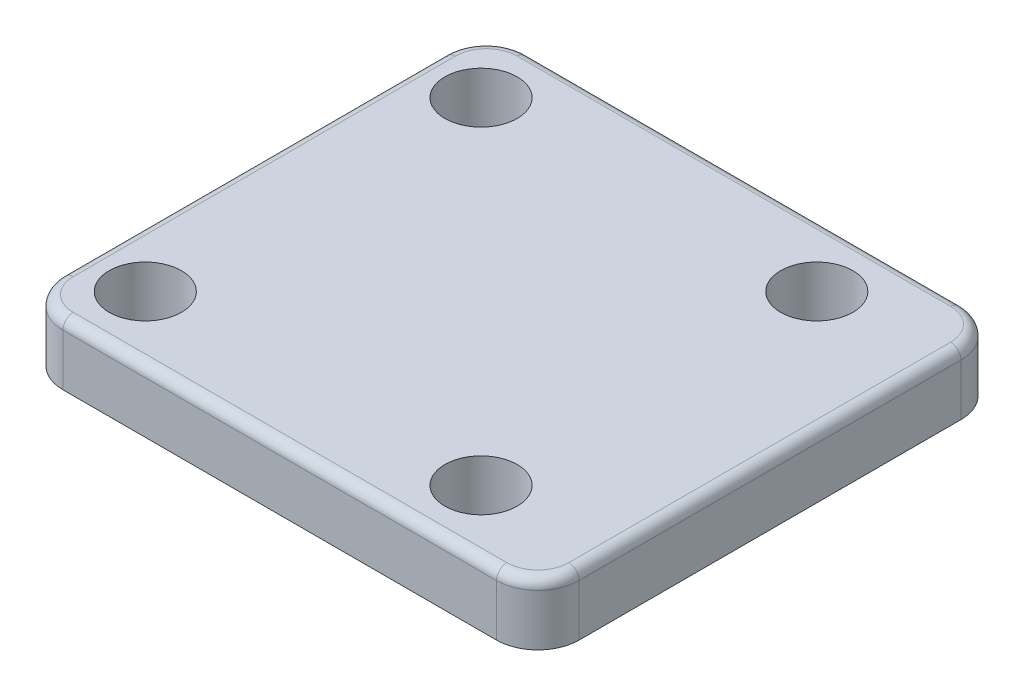
ISO-10303-21;
HEADER;
FILE_DESCRIPTION(('STEP AP214'),'2;1');
FILE_NAME('part.step','',(''),(''),'','','');
FILE_SCHEMA(('AUTOMOTIVE_DESIGN { 1 0 10303 214 1 1 1 1 }'));
ENDSEC;
DATA;
#1=APPLICATION_CONTEXT('core data for automotive mechanical design processes');
#2=APPLICATION_PROTOCOL_DEFINITION('international standard','automotive_design',2000,#1);
#3=PRODUCT_CONTEXT('',#1,'mechanical');
#4=PRODUCT('Part','Part','',(#3));
#5=PRODUCT_RELATED_PRODUCT_CATEGORY('part','',(#4));
#6=PRODUCT_DEFINITION_FORMATION('','',#4);
#7=PRODUCT_DEFINITION_CONTEXT('part definition',#1,'design');
#8=PRODUCT_DEFINITION('design','',#6,#7);
#9=PRODUCT_DEFINITION_SHAPE('','',#8);
#10=(LENGTH_UNIT() NAMED_UNIT(*) SI_UNIT(.MILLI.,.METRE.));
#11=(NAMED_UNIT(*) PLANE_ANGLE_UNIT() SI_UNIT($,.RADIAN.));
#12=(NAMED_UNIT(*) SI_UNIT($,.STERADIAN.) SOLID_ANGLE_UNIT());
#13=UNCERTAINTY_MEASURE_WITH_UNIT(LENGTH_MEASURE(1.E-05),#10,'distance_accuracy_value','');
#14=(GEOMETRIC_REPRESENTATION_CONTEXT(3) GLOBAL_UNCERTAINTY_ASSIGNED_CONTEXT((#13)) GLOBAL_UNIT_ASSIGNED_CONTEXT((#10,
#11,#12)) REPRESENTATION_CONTEXT('',''));
#15=CARTESIAN_POINT('',(0.,0.,0.));
#16=DIRECTION('',(0.,0.,1.));
#17=DIRECTION('',(1.,0.,0.));
#18=AXIS2_PLACEMENT_3D('',#15,#16,#17);
#19=CARTESIAN_POINT('',(24.,6.,-18.5));
#20=DIRECTION('',(0.,-1.,0.));
#21=DIRECTION('',(0.,0.,-1.));
#22=AXIS2_PLACEMENT_3D('',#19,#20,#21);
#23=CYLINDRICAL_SURFACE('',#22,4.);
#24=DIRECTION('',(0.,-1.,0.));
#25=VECTOR('',#24,1.);
#26=CARTESIAN_POINT('',(24.,6.,-22.5));
#27=LINE('',#26,#25);
#28=CARTESIAN_POINT('',(24.,5.,-22.5));
#29=VERTEX_POINT('',#28);
#30=CARTESIAN_POINT('',(24.,0.,-22.5));
#31=VERTEX_POINT('',#30);
#32=EDGE_CURVE('E132',#29,#31,#27,.T.);
#33=ORIENTED_EDGE('',*,*,#32,.F.);
#34=CARTESIAN_POINT('',(24.,5.,-18.5));
#35=DIRECTION('',(0.,-1.,0.));
#36=DIRECTION('',(0.,0.,-1.));
#37=AXIS2_PLACEMENT_3D('',#34,#35,#36);
#38=CIRCLE('',#37,4.);
#39=CARTESIAN_POINT('',(28.,5.,-18.5));
#40=VERTEX_POINT('',#39);
#41=EDGE_CURVE('E266',#29,#40,#38,.T.);
#42=ORIENTED_EDGE('',*,*,#41,.T.);
#43=DIRECTION('',(0.,-1.,0.));
#44=VECTOR('',#43,1.);
#45=CARTESIAN_POINT('',(28.,6.,-18.5));
#46=LINE('',#45,#44);
#47=CARTESIAN_POINT('',(28.,0.,-18.5));
#48=VERTEX_POINT('',#47);
#49=EDGE_CURVE('E157',#40,#48,#46,.T.);
#50=ORIENTED_EDGE('',*,*,#49,.T.);
#51=CARTESIAN_POINT('',(24.,0.,-18.5));
#52=DIRECTION('',(0.,1.,0.));
#53=DIRECTION('',(0.,0.,-1.));
#54=AXIS2_PLACEMENT_3D('',#51,#52,#53);
#55=CIRCLE('',#54,4.);
#56=EDGE_CURVE('E151',#48,#31,#55,.T.);
#57=ORIENTED_EDGE('',*,*,#56,.T.);
#58=EDGE_LOOP('',(#33,#42,#50,#57));
#59=FACE_BOUND('',#58,.T.);
#60=ADVANCED_FACE('F41',(#59),#23,.T.);
#61=CARTESIAN_POINT('',(-18.,6.,-22.5));
#62=DIRECTION('',(0.,0.,1.));
#63=DIRECTION('',(1.,0.,0.));
#64=AXIS2_PLACEMENT_3D('',#61,#62,#63);
#65=PLANE('',#64);
#66=DIRECTION('',(0.,-1.,0.));
#67=VECTOR('',#66,1.);
#68=CARTESIAN_POINT('',(-18.,6.,-22.5));
#69=LINE('',#68,#67);
#70=CARTESIAN_POINT('',(-18.,5.,-22.5));
#71=VERTEX_POINT('',#70);
#72=CARTESIAN_POINT('',(-18.,0.,-22.5));
#73=VERTEX_POINT('',#72);
#74=EDGE_CURVE('E145',#71,#73,#69,.T.);
#75=ORIENTED_EDGE('',*,*,#74,.F.);
#76=DIRECTION('',(-1.,0.,0.));
#77=VECTOR('',#76,1.);
#78=CARTESIAN_POINT('',(-18.,5.,-22.5));
#79=LINE('',#78,#77);
#80=EDGE_CURVE('E139',#71,#29,#79,.F.);
#81=ORIENTED_EDGE('',*,*,#80,.T.);
#82=ORIENTED_EDGE('',*,*,#32,.T.);
#83=DIRECTION('',(-1.,0.,0.));
#84=VECTOR('',#83,1.);
#85=CARTESIAN_POINT('',(-18.,0.,-22.5));
#86=LINE('',#85,#84);
#87=EDGE_CURVE('E136',#31,#73,#86,.T.);
#88=ORIENTED_EDGE('',*,*,#87,.T.);
#89=EDGE_LOOP('',(#75,#81,#82,#88));
#90=FACE_BOUND('',#89,.T.);
#91=ADVANCED_FACE('F135',(#90),#65,.F.);
#92=CARTESIAN_POINT('',(-18.,6.,-18.5));
#93=DIRECTION('',(0.,-1.,0.));
#94=DIRECTION('',(0.,0.,-1.));
#95=AXIS2_PLACEMENT_3D('',#92,#93,#94);
#96=CYLINDRICAL_SURFACE('',#95,4.);
#97=DIRECTION('',(0.,-1.,0.));
#98=VECTOR('',#97,1.);
#99=CARTESIAN_POINT('',(-22.,6.,-18.5));
#100=LINE('',#99,#98);
#101=CARTESIAN_POINT('',(-22.,5.,-18.5));
#102=VERTEX_POINT('',#101);
#103=CARTESIAN_POINT('',(-22.,0.,-18.5));
#104=VERTEX_POINT('',#103);
#105=EDGE_CURVE('E204',#102,#104,#100,.T.);
#106=ORIENTED_EDGE('',*,*,#105,.F.);
#107=CARTESIAN_POINT('',(-18.,5.,-18.5));
#108=DIRECTION('',(0.,-1.,0.));
#109=DIRECTION('',(0.,0.,-1.));
#110=AXIS2_PLACEMENT_3D('',#107,#108,#109);
#111=CIRCLE('',#110,4.);
#112=EDGE_CURVE('E261',#102,#71,#111,.T.);
#113=ORIENTED_EDGE('',*,*,#112,.T.);
#114=ORIENTED_EDGE('',*,*,#74,.T.);
#115=CARTESIAN_POINT('',(-18.,0.,-18.5));
#116=DIRECTION('',(0.,1.,0.));
#117=DIRECTION('',(0.,0.,1.));
#118=AXIS2_PLACEMENT_3D('',#115,#116,#117);
#119=CIRCLE('',#118,4.);
#120=EDGE_CURVE('E154',#73,#104,#119,.T.);
#121=ORIENTED_EDGE('',*,*,#120,.T.);
#122=EDGE_LOOP('',(#106,#113,#114,#121));
#123=FACE_BOUND('',#122,.T.);
#124=ADVANCED_FACE('F349',(#123),#96,.T.);
#125=CARTESIAN_POINT('',(-22.,6.,-18.5));
#126=DIRECTION('',(1.,0.,0.));
#127=DIRECTION('',(0.,0.,-1.));
#128=AXIS2_PLACEMENT_3D('',#125,#126,#127);
#129=PLANE('',#128);
#130=DIRECTION('',(0.,-1.,0.));
#131=VECTOR('',#130,1.);
#132=CARTESIAN_POINT('',(-22.,6.,18.5));
#133=LINE('',#132,#131);
#134=CARTESIAN_POINT('',(-22.,5.,18.5));
#135=VERTEX_POINT('',#134);
#136=CARTESIAN_POINT('',(-22.,0.,18.5));
#137=VERTEX_POINT('',#136);
#138=EDGE_CURVE('E201',#135,#137,#133,.T.);
#139=ORIENTED_EDGE('',*,*,#138,.F.);
#140=DIRECTION('',(0.,0.,1.));
#141=VECTOR('',#140,1.);
#142=CARTESIAN_POINT('',(-22.,5.,-18.5));
#143=LINE('',#142,#141);
#144=EDGE_CURVE('E258',#135,#102,#143,.F.);
#145=ORIENTED_EDGE('',*,*,#144,.T.);
#146=ORIENTED_EDGE('',*,*,#105,.T.);
#147=DIRECTION('',(0.,0.,1.));
#148=VECTOR('',#147,1.);
#149=CARTESIAN_POINT('',(-22.,0.,-18.5));
#150=LINE('',#149,#148);
#151=EDGE_CURVE('E171',#104,#137,#150,.T.);
#152=ORIENTED_EDGE('',*,*,#151,.T.);
#153=EDGE_LOOP('',(#139,#145,#146,#152));
#154=FACE_BOUND('',#153,.T.);
#155=ADVANCED_FACE('F420',(#154),#129,.F.);
#156=CARTESIAN_POINT('',(-18.,6.,18.5));
#157=DIRECTION('',(0.,-1.,0.));
#158=DIRECTION('',(0.,0.,-1.));
#159=AXIS2_PLACEMENT_3D('',#156,#157,#158);
#160=CYLINDRICAL_SURFACE('',#159,4.);
#161=DIRECTION('',(0.,-1.,0.));
#162=VECTOR('',#161,1.);
#163=CARTESIAN_POINT('',(-18.,6.,22.5));
#164=LINE('',#163,#162);
#165=CARTESIAN_POINT('',(-18.,5.,22.5));
#166=VERTEX_POINT('',#165);
#167=CARTESIAN_POINT('',(-18.,0.,22.5));
#168=VERTEX_POINT('',#167);
#169=EDGE_CURVE('E198',#166,#168,#164,.T.);
#170=ORIENTED_EDGE('',*,*,#169,.F.);
#171=CARTESIAN_POINT('',(-18.,5.,18.5));
#172=DIRECTION('',(0.,-1.,0.));
#173=DIRECTION('',(0.,0.,-1.));
#174=AXIS2_PLACEMENT_3D('',#171,#172,#173);
#175=CIRCLE('',#174,4.);
#176=EDGE_CURVE('E254',#166,#135,#175,.T.);
#177=ORIENTED_EDGE('',*,*,#176,.T.);
#178=ORIENTED_EDGE('',*,*,#138,.T.);
#179=CARTESIAN_POINT('',(-18.,0.,18.5));
#180=DIRECTION('',(0.,1.,0.));
#181=DIRECTION('',(0.,0.,1.));
#182=AXIS2_PLACEMENT_3D('',#179,#180,#181);
#183=CIRCLE('',#182,4.);
#184=EDGE_CURVE('E175',#137,#168,#183,.T.);
#185=ORIENTED_EDGE('',*,*,#184,.T.);
#186=EDGE_LOOP('',(#170,#177,#178,#185));
#187=FACE_BOUND('',#186,.T.);
#188=ADVANCED_FACE('F409',(#187),#160,.T.);
#189=CARTESIAN_POINT('',(-18.,6.,22.5));
#190=DIRECTION('',(0.,0.,-1.));
#191=DIRECTION('',(-1.,0.,0.));
#192=AXIS2_PLACEMENT_3D('',#189,#190,#191);
#193=PLANE('',#192);
#194=DIRECTION('',(0.,-1.,0.));
#195=VECTOR('',#194,1.);
#196=CARTESIAN_POINT('',(24.,6.,22.5));
#197=LINE('',#196,#195);
#198=CARTESIAN_POINT('',(24.,5.,22.5));
#199=VERTEX_POINT('',#198);
#200=CARTESIAN_POINT('',(24.,0.,22.5));
#201=VERTEX_POINT('',#200);
#202=EDGE_CURVE('E195',#199,#201,#197,.T.);
#203=ORIENTED_EDGE('',*,*,#202,.F.);
#204=DIRECTION('',(1.,0.,0.));
#205=VECTOR('',#204,1.);
#206=CARTESIAN_POINT('',(-18.,5.,22.5));
#207=LINE('',#206,#205);
#208=EDGE_CURVE('E11',#199,#166,#207,.F.);
#209=ORIENTED_EDGE('',*,*,#208,.T.);
#210=ORIENTED_EDGE('',*,*,#169,.T.);
#211=DIRECTION('',(1.,0.,0.));
#212=VECTOR('',#211,1.);
#213=CARTESIAN_POINT('',(-18.,0.,22.5));
#214=LINE('',#213,#212);
#215=EDGE_CURVE('E179',#168,#201,#214,.T.);
#216=ORIENTED_EDGE('',*,*,#215,.T.);
#217=EDGE_LOOP('',(#203,#209,#210,#216));
#218=FACE_BOUND('',#217,.T.);
#219=ADVANCED_FACE('F406',(#218),#193,.F.);
#220=CARTESIAN_POINT('',(24.,6.,18.5));
#221=DIRECTION('',(0.,-1.,0.));
#222=DIRECTION('',(0.,0.,-1.));
#223=AXIS2_PLACEMENT_3D('',#220,#221,#222);
#224=CYLINDRICAL_SURFACE('',#223,4.);
#225=DIRECTION('',(0.,-1.,0.));
#226=VECTOR('',#225,1.);
#227=CARTESIAN_POINT('',(28.,6.,18.5));
#228=LINE('',#227,#226);
#229=CARTESIAN_POINT('',(28.,5.,18.5));
#230=VERTEX_POINT('',#229);
#231=CARTESIAN_POINT('',(28.,0.,18.5));
#232=VERTEX_POINT('',#231);
#233=EDGE_CURVE('E192',#230,#232,#228,.T.);
#234=ORIENTED_EDGE('',*,*,#233,.F.);
#235=CARTESIAN_POINT('',(24.,5.,18.5));
#236=DIRECTION('',(0.,-1.,0.));
#237=DIRECTION('',(0.,0.,-1.));
#238=AXIS2_PLACEMENT_3D('',#235,#236,#237);
#239=CIRCLE('',#238,4.);
#240=EDGE_CURVE('E51',#230,#199,#239,.T.);
#241=ORIENTED_EDGE('',*,*,#240,.T.);
#242=ORIENTED_EDGE('',*,*,#202,.T.);
#243=CARTESIAN_POINT('',(24.,0.,18.5));
#244=DIRECTION('',(0.,1.,0.));
#245=DIRECTION('',(0.,0.,1.));
#246=AXIS2_PLACEMENT_3D('',#243,#244,#245);
#247=CIRCLE('',#246,4.);
#248=EDGE_CURVE('E183',#201,#232,#247,.T.);
#249=ORIENTED_EDGE('',*,*,#248,.T.);
#250=EDGE_LOOP('',(#234,#241,#242,#249));
#251=FACE_BOUND('',#250,.T.);
#252=ADVANCED_FACE('F340',(#251),#224,.T.);
#253=CARTESIAN_POINT('',(28.,6.,-18.5));
#254=DIRECTION('',(-1.,0.,0.));
#255=DIRECTION('',(0.,0.,1.));
#256=AXIS2_PLACEMENT_3D('',#253,#254,#255);
#257=PLANE('',#256);
#258=ORIENTED_EDGE('',*,*,#49,.F.);
#259=DIRECTION('',(0.,0.,-1.));
#260=VECTOR('',#259,1.);
#261=CARTESIAN_POINT('',(28.,5.,-18.5));
#262=LINE('',#261,#260);
#263=EDGE_CURVE('E66',#40,#230,#262,.F.);
#264=ORIENTED_EDGE('',*,*,#263,.T.);
#265=ORIENTED_EDGE('',*,*,#233,.T.);
#266=DIRECTION('',(0.,0.,-1.));
#267=VECTOR('',#266,1.);
#268=CARTESIAN_POINT('',(28.,0.,-18.5));
#269=LINE('',#268,#267);
#270=EDGE_CURVE('E187',#232,#48,#269,.T.);
#271=ORIENTED_EDGE('',*,*,#270,.T.);
#272=EDGE_LOOP('',(#258,#264,#265,#271));
#273=FACE_BOUND('',#272,.T.);
#274=ADVANCED_FACE('F330',(#273),#257,.F.);
#275=CARTESIAN_POINT('',(24.,6.,-18.5));
#276=DIRECTION('',(0.,-1.,0.));
#277=DIRECTION('',(0.,0.,-1.));
#278=AXIS2_PLACEMENT_3D('',#275,#276,#277);
#279=PLANE('',#278);
#280=DIRECTION('',(0.,0.,1.));
#281=VECTOR('',#280,1.);
#282=CARTESIAN_POINT('',(-21.,6.,-18.5));
#283=LINE('',#282,#281);
#284=CARTESIAN_POINT('',(-21.,6.,-18.5));
#285=VERTEX_POINT('',#284);
#286=CARTESIAN_POINT('',(-21.,6.,18.5));
#287=VERTEX_POINT('',#286);
#288=EDGE_CURVE('E247',#285,#287,#283,.T.);
#289=ORIENTED_EDGE('',*,*,#288,.T.);
#290=CARTESIAN_POINT('',(-18.,6.,18.5));
#291=DIRECTION('',(0.,-1.,0.));
#292=DIRECTION('',(0.,0.,-1.));
#293=AXIS2_PLACEMENT_3D('',#290,#291,#292);
#294=CIRCLE('',#293,3.);
#295=CARTESIAN_POINT('',(-18.,6.,21.5));
#296=VERTEX_POINT('',#295);
#297=EDGE_CURVE('E250',#287,#296,#294,.F.);
#298=ORIENTED_EDGE('',*,*,#297,.T.);
#299=DIRECTION('',(1.,0.,0.));
#300=VECTOR('',#299,1.);
#301=CARTESIAN_POINT('',(24.,6.,21.5));
#302=LINE('',#301,#300);
#303=CARTESIAN_POINT('',(24.,6.,21.5));
#304=VERTEX_POINT('',#303);
#305=EDGE_CURVE('E217',#296,#304,#302,.T.);
#306=ORIENTED_EDGE('',*,*,#305,.T.);
#307=CARTESIAN_POINT('',(24.,6.,18.5));
#308=DIRECTION('',(0.,-1.,0.));
#309=DIRECTION('',(0.,0.,-1.));
#310=AXIS2_PLACEMENT_3D('',#307,#308,#309);
#311=CIRCLE('',#310,3.);
#312=CARTESIAN_POINT('',(27.,6.,18.5));
#313=VERTEX_POINT('',#312);
#314=EDGE_CURVE('E232',#304,#313,#311,.F.);
#315=ORIENTED_EDGE('',*,*,#314,.T.);
#316=DIRECTION('',(0.,0.,-1.));
#317=VECTOR('',#316,1.);
#318=CARTESIAN_POINT('',(27.,6.,-18.5));
#319=LINE('',#318,#317);
#320=CARTESIAN_POINT('',(27.,6.,-18.5));
#321=VERTEX_POINT('',#320);
#322=EDGE_CURVE('E235',#313,#321,#319,.T.);
#323=ORIENTED_EDGE('',*,*,#322,.T.);
#324=CARTESIAN_POINT('',(24.,6.,-18.5));
#325=DIRECTION('',(0.,-1.,0.));
#326=DIRECTION('',(0.,0.,-1.));
#327=AXIS2_PLACEMENT_3D('',#324,#325,#326);
#328=CIRCLE('',#327,3.);
#329=CARTESIAN_POINT('',(24.,6.,-21.5));
#330=VERTEX_POINT('',#329);
#331=EDGE_CURVE('E238',#321,#330,#328,.F.);
#332=ORIENTED_EDGE('',*,*,#331,.T.);
#333=DIRECTION('',(-1.,0.,0.));
#334=VECTOR('',#333,1.);
#335=CARTESIAN_POINT('',(24.,6.,-21.5));
#336=LINE('',#335,#334);
#337=CARTESIAN_POINT('',(-18.,6.,-21.5));
#338=VERTEX_POINT('',#337);
#339=EDGE_CURVE('E241',#330,#338,#336,.T.);
#340=ORIENTED_EDGE('',*,*,#339,.T.);
#341=CARTESIAN_POINT('',(-18.,6.,-18.5));
#342=DIRECTION('',(0.,-1.,0.));
#343=DIRECTION('',(0.,0.,-1.));
#344=AXIS2_PLACEMENT_3D('',#341,#342,#343);
#345=CIRCLE('',#344,3.);
#346=EDGE_CURVE('E244',#338,#285,#345,.F.);
#347=ORIENTED_EDGE('',*,*,#346,.T.);
#348=EDGE_LOOP('',(#289,#298,#306,#315,#323,#332,#340,#347));
#349=FACE_BOUND('',#348,.T.);
#350=CARTESIAN_POINT('',(-16.2634559672906,6.,-16.2634559672897));
#351=DIRECTION('',(0.,1.,0.));
#352=DIRECTION('',(0.,0.,1.));
#353=AXIS2_PLACEMENT_3D('',#350,#351,#352);
#354=CIRCLE('',#353,3.50000000000097);
#355=CARTESIAN_POINT('',(-16.2634559672906,6.,-12.7634559672887));
#356=VERTEX_POINT('',#355);
#357=EDGE_CURVE('E302',#356,#356,#354,.T.);
#358=ORIENTED_EDGE('',*,*,#357,.F.);
#359=EDGE_LOOP('',(#358));
#360=FACE_BOUND('',#359,.T.);
#361=CARTESIAN_POINT('',(-16.2634559672897,6.,16.2634559672915));
#362=DIRECTION('',(0.,1.,0.));
#363=DIRECTION('',(0.,0.,1.));
#364=AXIS2_PLACEMENT_3D('',#361,#362,#363);
#365=CIRCLE('',#364,3.50000000000069);
#366=CARTESIAN_POINT('',(-16.2634559672897,6.,19.7634559672922));
#367=VERTEX_POINT('',#366);
#368=EDGE_CURVE('E308',#367,#367,#365,.T.);
#369=ORIENTED_EDGE('',*,*,#368,.F.);
#370=EDGE_LOOP('',(#369));
#371=FACE_BOUND('',#370,.T.);
#372=CARTESIAN_POINT('',(16.2634559672915,6.,16.2634559672906));
#373=DIRECTION('',(0.,1.,0.));
#374=DIRECTION('',(0.,0.,1.));
#375=AXIS2_PLACEMENT_3D('',#372,#373,#374);
#376=CIRCLE('',#375,3.49999999999977);
#377=CARTESIAN_POINT('',(16.2634559672915,6.,19.7634559672903));
#378=VERTEX_POINT('',#377);
#379=EDGE_CURVE('E314',#378,#378,#376,.T.);
#380=ORIENTED_EDGE('',*,*,#379,.F.);
#381=EDGE_LOOP('',(#380));
#382=FACE_BOUND('',#381,.T.);
#383=CARTESIAN_POINT('',(16.2634559672906,6.,-16.2634559672906));
#384=DIRECTION('',(0.,1.,0.));
#385=DIRECTION('',(0.,0.,1.));
#386=AXIS2_PLACEMENT_3D('',#383,#384,#385);
#387=CIRCLE('',#386,3.5);
#388=CARTESIAN_POINT('',(16.2634559672906,6.,-12.7634559672906));
#389=VERTEX_POINT('',#388);
#390=EDGE_CURVE('E223',#389,#389,#387,.T.);
#391=ORIENTED_EDGE('',*,*,#390,.F.);
#392=EDGE_LOOP('',(#391));
#393=FACE_BOUND('',#392,.T.);
#394=ADVANCED_FACE('F327',(#349,#360,#371,#382,#393),#279,.F.);
#395=CARTESIAN_POINT('',(24.,0.,-18.5));
#396=DIRECTION('',(0.,-1.,0.));
#397=DIRECTION('',(0.,0.,-1.));
#398=AXIS2_PLACEMENT_3D('',#395,#396,#397);
#399=PLANE('',#398);
#400=CARTESIAN_POINT('',(-16.2634559672906,0.,-16.2634559672897));
#401=DIRECTION('',(0.,-1.,0.));
#402=DIRECTION('',(0.,0.,-1.));
#403=AXIS2_PLACEMENT_3D('',#400,#401,#402);
#404=CIRCLE('',#403,3.50000000000097);
#405=CARTESIAN_POINT('',(-16.2634559672906,0.,-19.7634559672906));
#406=VERTEX_POINT('',#405);
#407=EDGE_CURVE('E160',#406,#406,#404,.T.);
#408=ORIENTED_EDGE('',*,*,#407,.F.);
#409=EDGE_LOOP('',(#408));
#410=FACE_BOUND('',#409,.T.);
#411=CARTESIAN_POINT('',(-16.2634559672897,0.,16.2634559672915));
#412=DIRECTION('',(0.,-1.,0.));
#413=DIRECTION('',(0.,0.,-1.));
#414=AXIS2_PLACEMENT_3D('',#411,#412,#413);
#415=CIRCLE('',#414,3.50000000000069);
#416=CARTESIAN_POINT('',(-16.2634559672897,0.,12.7634559672908));
#417=VERTEX_POINT('',#416);
#418=EDGE_CURVE('E164',#417,#417,#415,.T.);
#419=ORIENTED_EDGE('',*,*,#418,.F.);
#420=EDGE_LOOP('',(#419));
#421=FACE_BOUND('',#420,.T.);
#422=CARTESIAN_POINT('',(16.2634559672915,0.,16.2634559672906));
#423=DIRECTION('',(0.,-1.,0.));
#424=DIRECTION('',(0.,0.,-1.));
#425=AXIS2_PLACEMENT_3D('',#422,#423,#424);
#426=CIRCLE('',#425,3.49999999999977);
#427=CARTESIAN_POINT('',(16.2634559672915,0.,12.7634559672908));
#428=VERTEX_POINT('',#427);
#429=EDGE_CURVE('E222',#428,#428,#426,.T.);
#430=ORIENTED_EDGE('',*,*,#429,.F.);
#431=EDGE_LOOP('',(#430));
#432=FACE_BOUND('',#431,.T.);
#433=CARTESIAN_POINT('',(16.2634559672906,0.,-16.2634559672906));
#434=DIRECTION('',(0.,-1.,0.));
#435=DIRECTION('',(0.,0.,-1.));
#436=AXIS2_PLACEMENT_3D('',#433,#434,#435);
#437=CIRCLE('',#436,3.5);
#438=CARTESIAN_POINT('',(16.2634559672906,0.,-19.7634559672906));
#439=VERTEX_POINT('',#438);
#440=EDGE_CURVE('E218',#439,#439,#437,.T.);
#441=ORIENTED_EDGE('',*,*,#440,.F.);
#442=EDGE_LOOP('',(#441));
#443=FACE_BOUND('',#442,.T.);
#444=CARTESIAN_POINT('',(0.,0.,0.));
#445=DIRECTION('',(0.,-1.,0.));
#446=DIRECTION('',(0.,0.,-1.));
#447=AXIS2_PLACEMENT_3D('',#444,#445,#446);
#448=CIRCLE('',#447,16.);
#449=CARTESIAN_POINT('',(0.,0.,-16.));
#450=VERTEX_POINT('',#449);
#451=EDGE_CURVE('E144',#450,#450,#448,.T.);
#452=ORIENTED_EDGE('',*,*,#451,.F.);
#453=EDGE_LOOP('',(#452));
#454=FACE_BOUND('',#453,.T.);
#455=ORIENTED_EDGE('',*,*,#56,.F.);
#456=ORIENTED_EDGE('',*,*,#270,.F.);
#457=ORIENTED_EDGE('',*,*,#248,.F.);
#458=ORIENTED_EDGE('',*,*,#215,.F.);
#459=ORIENTED_EDGE('',*,*,#184,.F.);
#460=ORIENTED_EDGE('',*,*,#151,.F.);
#461=ORIENTED_EDGE('',*,*,#120,.F.);
#462=ORIENTED_EDGE('',*,*,#87,.F.);
#463=EDGE_LOOP('',(#455,#456,#457,#458,#459,#460,#461,#462));
#464=FACE_BOUND('',#463,.T.);
#465=ADVANCED_FACE('F149',(#410,#421,#432,#443,#454,#464),#399,.T.);
#466=CARTESIAN_POINT('',(0.,-2.,0.));
#467=DIRECTION('',(0.,1.,0.));
#468=DIRECTION('',(0.,0.,1.));
#469=AXIS2_PLACEMENT_3D('',#466,#467,#468);
#470=CYLINDRICAL_SURFACE('',#469,16.);
#471=CARTESIAN_POINT('',(0.,-0.999999999999999,0.));
#472=DIRECTION('',(0.,-1.,0.));
#473=DIRECTION('',(0.,0.,-1.));
#474=AXIS2_PLACEMENT_3D('',#471,#472,#473);
#475=CIRCLE('',#474,16.);
#476=CARTESIAN_POINT('',(0.,-0.999999999999999,-16.));
#477=VERTEX_POINT('',#476);
#478=EDGE_CURVE('E213',#477,#477,#475,.F.);
#479=ORIENTED_EDGE('',*,*,#478,.T.);
#480=EDGE_LOOP('',(#479));
#481=FACE_BOUND('',#480,.T.);
#482=ORIENTED_EDGE('',*,*,#451,.T.);
#483=EDGE_LOOP('',(#482));
#484=FACE_BOUND('',#483,.T.);
#485=ADVANCED_FACE('F337',(#481,#484),#470,.T.);
#486=CARTESIAN_POINT('',(0.,-2.,0.));
#487=DIRECTION('',(0.,-1.,0.));
#488=DIRECTION('',(0.,0.,-1.));
#489=AXIS2_PLACEMENT_3D('',#486,#487,#488);
#490=PLANE('',#489);
#491=CARTESIAN_POINT('',(0.,-2.,0.));
#492=DIRECTION('',(0.,-1.,0.));
#493=DIRECTION('',(0.,0.,-1.));
#494=AXIS2_PLACEMENT_3D('',#491,#492,#493);
#495=CIRCLE('',#494,15.);
#496=CARTESIAN_POINT('',(0.,-2.,-15.));
#497=VERTEX_POINT('',#496);
#498=EDGE_CURVE('E209',#497,#497,#495,.T.);
#499=ORIENTED_EDGE('',*,*,#498,.T.);
#500=EDGE_LOOP('',(#499));
#501=FACE_BOUND('',#500,.T.);
#502=ADVANCED_FACE('F360',(#501),#490,.T.);
#503=CARTESIAN_POINT('',(0.,-2.,0.));
#504=DIRECTION('',(0.,1.,0.));
#505=DIRECTION('',(0.,0.,1.));
#506=AXIS2_PLACEMENT_3D('',#503,#504,#505);
#507=CONICAL_SURFACE('',#506,15.,0.785398163397448);
#508=ORIENTED_EDGE('',*,*,#478,.F.);
#509=EDGE_LOOP('',(#508));
#510=FACE_BOUND('',#509,.T.);
#511=ORIENTED_EDGE('',*,*,#498,.F.);
#512=EDGE_LOOP('',(#511));
#513=FACE_BOUND('',#512,.T.);
#514=ADVANCED_FACE('F354',(#510,#513),#507,.T.);
#515=CARTESIAN_POINT('',(16.2634559672906,-2.,-16.2634559672906));
#516=DIRECTION('',(0.,1.,0.));
#517=DIRECTION('',(0.,0.,1.));
#518=AXIS2_PLACEMENT_3D('',#515,#516,#517);
#519=CYLINDRICAL_SURFACE('',#518,3.5);
#520=ORIENTED_EDGE('',*,*,#440,.T.);
#521=EDGE_LOOP('',(#520));
#522=FACE_BOUND('',#521,.T.);
#523=ORIENTED_EDGE('',*,*,#390,.T.);
#524=EDGE_LOOP('',(#523));
#525=FACE_BOUND('',#524,.T.);
#526=ADVANCED_FACE('F359',(#522,#525),#519,.F.);
#527=CARTESIAN_POINT('',(16.2634559672915,-2.,16.2634559672906));
#528=DIRECTION('',(0.,1.,0.));
#529=DIRECTION('',(0.,0.,1.));
#530=AXIS2_PLACEMENT_3D('',#527,#528,#529);
#531=CYLINDRICAL_SURFACE('',#530,3.49999999999977);
#532=ORIENTED_EDGE('',*,*,#429,.T.);
#533=EDGE_LOOP('',(#532));
#534=FACE_BOUND('',#533,.T.);
#535=ORIENTED_EDGE('',*,*,#379,.T.);
#536=EDGE_LOOP('',(#535));
#537=FACE_BOUND('',#536,.T.);
#538=ADVANCED_FACE('F325',(#534,#537),#531,.F.);
#539=CARTESIAN_POINT('',(-16.2634559672897,-2.,16.2634559672915));
#540=DIRECTION('',(0.,1.,0.));
#541=DIRECTION('',(0.,0.,1.));
#542=AXIS2_PLACEMENT_3D('',#539,#540,#541);
#543=CYLINDRICAL_SURFACE('',#542,3.50000000000069);
#544=ORIENTED_EDGE('',*,*,#418,.T.);
#545=EDGE_LOOP('',(#544));
#546=FACE_BOUND('',#545,.T.);
#547=ORIENTED_EDGE('',*,*,#368,.T.);
#548=EDGE_LOOP('',(#547));
#549=FACE_BOUND('',#548,.T.);
#550=ADVANCED_FACE('F394',(#546,#549),#543,.F.);
#551=CARTESIAN_POINT('',(-16.2634559672906,-2.,-16.2634559672897));
#552=DIRECTION('',(0.,1.,0.));
#553=DIRECTION('',(0.,0.,1.));
#554=AXIS2_PLACEMENT_3D('',#551,#552,#553);
#555=CYLINDRICAL_SURFACE('',#554,3.50000000000097);
#556=ORIENTED_EDGE('',*,*,#407,.T.);
#557=EDGE_LOOP('',(#556));
#558=FACE_BOUND('',#557,.T.);
#559=ORIENTED_EDGE('',*,*,#357,.T.);
#560=EDGE_LOOP('',(#559));
#561=FACE_BOUND('',#560,.T.);
#562=ADVANCED_FACE('F389',(#558,#561),#555,.F.);
#563=CARTESIAN_POINT('',(24.,5.,-18.5));
#564=DIRECTION('',(0.,-1.,0.));
#565=DIRECTION('',(0.,0.,-1.));
#566=AXIS2_PLACEMENT_3D('',#563,#564,#565);
#567=TOROIDAL_SURFACE('',#566,3.,1.);
#568=CARTESIAN_POINT('',(27.,5.,-18.5));
#569=DIRECTION('',(0.,0.,1.));
#570=DIRECTION('',(1.,0.,0.));
#571=AXIS2_PLACEMENT_3D('',#568,#569,#570);
#572=CIRCLE('',#571,1.);
#573=EDGE_CURVE('E294',#40,#321,#572,.T.);
#574=ORIENTED_EDGE('',*,*,#573,.F.);
#575=ORIENTED_EDGE('',*,*,#41,.F.);
#576=CARTESIAN_POINT('',(24.,5.,-21.5));
#577=DIRECTION('',(-1.,0.,0.));
#578=DIRECTION('',(0.,0.,1.));
#579=AXIS2_PLACEMENT_3D('',#576,#577,#578);
#580=CIRCLE('',#579,1.);
#581=EDGE_CURVE('E45',#330,#29,#580,.T.);
#582=ORIENTED_EDGE('',*,*,#581,.F.);
#583=ORIENTED_EDGE('',*,*,#331,.F.);
#584=EDGE_LOOP('',(#574,#575,#582,#583));
#585=FACE_BOUND('',#584,.T.);
#586=ADVANCED_FACE('F43',(#585),#567,.T.);
#587=CARTESIAN_POINT('',(24.,5.,-21.5));
#588=DIRECTION('',(-1.,0.,0.));
#589=DIRECTION('',(0.,0.,1.));
#590=AXIS2_PLACEMENT_3D('',#587,#588,#589);
#591=CYLINDRICAL_SURFACE('',#590,1.);
#592=ORIENTED_EDGE('',*,*,#581,.T.);
#593=ORIENTED_EDGE('',*,*,#80,.F.);
#594=CARTESIAN_POINT('',(-18.,5.,-21.5));
#595=DIRECTION('',(-1.,0.,0.));
#596=DIRECTION('',(0.,0.,1.));
#597=AXIS2_PLACEMENT_3D('',#594,#595,#596);
#598=CIRCLE('',#597,1.);
#599=EDGE_CURVE('E291',#338,#71,#598,.T.);
#600=ORIENTED_EDGE('',*,*,#599,.F.);
#601=ORIENTED_EDGE('',*,*,#339,.F.);
#602=EDGE_LOOP('',(#592,#593,#600,#601));
#603=FACE_BOUND('',#602,.T.);
#604=ADVANCED_FACE('F384',(#603),#591,.T.);
#605=CARTESIAN_POINT('',(27.,5.,-18.5));
#606=DIRECTION('',(0.,0.,-1.));
#607=DIRECTION('',(-1.,0.,0.));
#608=AXIS2_PLACEMENT_3D('',#605,#606,#607);
#609=CYLINDRICAL_SURFACE('',#608,1.);
#610=ORIENTED_EDGE('',*,*,#573,.T.);
#611=ORIENTED_EDGE('',*,*,#322,.F.);
#612=CARTESIAN_POINT('',(27.,5.,18.5));
#613=DIRECTION('',(0.,0.,1.));
#614=DIRECTION('',(1.,0.,0.));
#615=AXIS2_PLACEMENT_3D('',#612,#613,#614);
#616=CIRCLE('',#615,1.);
#617=EDGE_CURVE('E287',#230,#313,#616,.T.);
#618=ORIENTED_EDGE('',*,*,#617,.F.);
#619=ORIENTED_EDGE('',*,*,#263,.F.);
#620=EDGE_LOOP('',(#610,#611,#618,#619));
#621=FACE_BOUND('',#620,.T.);
#622=ADVANCED_FACE('F381',(#621),#609,.T.);
#623=CARTESIAN_POINT('',(-18.,5.,-18.5));
#624=DIRECTION('',(0.,-1.,0.));
#625=DIRECTION('',(0.,0.,-1.));
#626=AXIS2_PLACEMENT_3D('',#623,#624,#625);
#627=TOROIDAL_SURFACE('',#626,3.,1.);
#628=ORIENTED_EDGE('',*,*,#599,.T.);
#629=ORIENTED_EDGE('',*,*,#112,.F.);
#630=CARTESIAN_POINT('',(-21.,5.,-18.5));
#631=DIRECTION('',(0.,0.,1.));
#632=DIRECTION('',(1.,0.,0.));
#633=AXIS2_PLACEMENT_3D('',#630,#631,#632);
#634=CIRCLE('',#633,1.);
#635=EDGE_CURVE('E283',#285,#102,#634,.T.);
#636=ORIENTED_EDGE('',*,*,#635,.F.);
#637=ORIENTED_EDGE('',*,*,#346,.F.);
#638=EDGE_LOOP('',(#628,#629,#636,#637));
#639=FACE_BOUND('',#638,.T.);
#640=ADVANCED_FACE('F377',(#639),#627,.T.);
#641=CARTESIAN_POINT('',(24.,5.,18.5));
#642=DIRECTION('',(0.,-1.,0.));
#643=DIRECTION('',(0.,0.,-1.));
#644=AXIS2_PLACEMENT_3D('',#641,#642,#643);
#645=TOROIDAL_SURFACE('',#644,3.,1.);
#646=ORIENTED_EDGE('',*,*,#617,.T.);
#647=ORIENTED_EDGE('',*,*,#314,.F.);
#648=CARTESIAN_POINT('',(24.,5.,21.5));
#649=DIRECTION('',(-1.,0.,0.));
#650=DIRECTION('',(0.,0.,1.));
#651=AXIS2_PLACEMENT_3D('',#648,#649,#650);
#652=CIRCLE('',#651,1.);
#653=EDGE_CURVE('E279',#199,#304,#652,.T.);
#654=ORIENTED_EDGE('',*,*,#653,.F.);
#655=ORIENTED_EDGE('',*,*,#240,.F.);
#656=EDGE_LOOP('',(#646,#647,#654,#655));
#657=FACE_BOUND('',#656,.T.);
#658=ADVANCED_FACE('F373',(#657),#645,.T.);
#659=CARTESIAN_POINT('',(-21.,5.,-18.5));
#660=DIRECTION('',(0.,0.,1.));
#661=DIRECTION('',(1.,0.,0.));
#662=AXIS2_PLACEMENT_3D('',#659,#660,#661);
#663=CYLINDRICAL_SURFACE('',#662,1.);
#664=ORIENTED_EDGE('',*,*,#635,.T.);
#665=ORIENTED_EDGE('',*,*,#144,.F.);
#666=CARTESIAN_POINT('',(-21.,5.,18.5));
#667=DIRECTION('',(0.,0.,1.));
#668=DIRECTION('',(1.,0.,0.));
#669=AXIS2_PLACEMENT_3D('',#666,#667,#668);
#670=CIRCLE('',#669,1.);
#671=EDGE_CURVE('E276',#287,#135,#670,.T.);
#672=ORIENTED_EDGE('',*,*,#671,.F.);
#673=ORIENTED_EDGE('',*,*,#288,.F.);
#674=EDGE_LOOP('',(#664,#665,#672,#673));
#675=FACE_BOUND('',#674,.T.);
#676=ADVANCED_FACE('F369',(#675),#663,.T.);
#677=CARTESIAN_POINT('',(24.,5.,21.5));
#678=DIRECTION('',(1.,0.,0.));
#679=DIRECTION('',(0.,0.,-1.));
#680=AXIS2_PLACEMENT_3D('',#677,#678,#679);
#681=CYLINDRICAL_SURFACE('',#680,1.);
#682=ORIENTED_EDGE('',*,*,#653,.T.);
#683=ORIENTED_EDGE('',*,*,#305,.F.);
#684=CARTESIAN_POINT('',(-18.,5.,21.5));
#685=DIRECTION('',(-1.,0.,0.));
#686=DIRECTION('',(0.,0.,1.));
#687=AXIS2_PLACEMENT_3D('',#684,#685,#686);
#688=CIRCLE('',#687,1.);
#689=EDGE_CURVE('E273',#166,#296,#688,.T.);
#690=ORIENTED_EDGE('',*,*,#689,.F.);
#691=ORIENTED_EDGE('',*,*,#208,.F.);
#692=EDGE_LOOP('',(#682,#683,#690,#691));
#693=FACE_BOUND('',#692,.T.);
#694=ADVANCED_FACE('F365',(#693),#681,.T.);
#695=CARTESIAN_POINT('',(-18.,5.,18.5));
#696=DIRECTION('',(0.,-1.,0.));
#697=DIRECTION('',(0.,0.,-1.));
#698=AXIS2_PLACEMENT_3D('',#695,#696,#697);
#699=TOROIDAL_SURFACE('',#698,3.,1.);
#700=ORIENTED_EDGE('',*,*,#671,.T.);
#701=ORIENTED_EDGE('',*,*,#176,.F.);
#702=ORIENTED_EDGE('',*,*,#689,.T.);
#703=ORIENTED_EDGE('',*,*,#297,.F.);
#704=EDGE_LOOP('',(#700,#701,#702,#703));
#705=FACE_BOUND('',#704,.T.);
#706=ADVANCED_FACE('F362',(#705),#699,.T.);
#707=CLOSED_SHELL('',(#60,#91,#124,#155,#188,#219,#252,#274,#394,#465,#485,#502,#514,#526,#538,
#550,#562,#586,#604,#622,#640,#658,#676,#694,#706));
#708=MANIFOLD_SOLID_BREP('B2',#707);
#709=ADVANCED_BREP_SHAPE_REPRESENTATION('',(#18,#708),#14);
#710=SHAPE_DEFINITION_REPRESENTATION(#9,#709);
ENDSEC;
END-ISO-10303-21;
